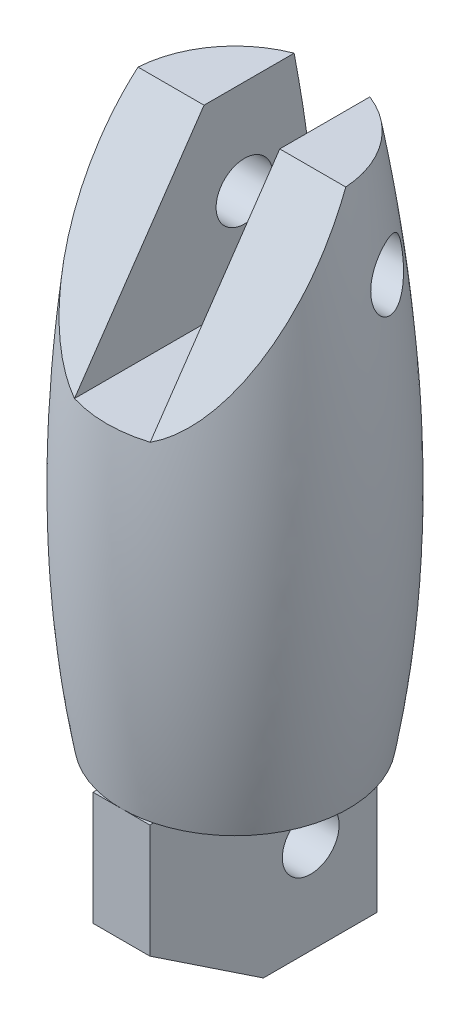
ISO-10303-21;
HEADER;
FILE_DESCRIPTION(('STEP AP214'),'2;1');
FILE_NAME('part.step','',(''),(''),'','','');
FILE_SCHEMA(('AUTOMOTIVE_DESIGN { 1 0 10303 214 1 1 1 1 }'));
ENDSEC;
DATA;
#1=APPLICATION_CONTEXT('core data for automotive mechanical design processes');
#2=APPLICATION_PROTOCOL_DEFINITION('international standard','automotive_design',2000,#1);
#3=PRODUCT_CONTEXT('',#1,'mechanical');
#4=PRODUCT('Part','Part','',(#3));
#5=PRODUCT_RELATED_PRODUCT_CATEGORY('part','',(#4));
#6=PRODUCT_DEFINITION_FORMATION('','',#4);
#7=PRODUCT_DEFINITION_CONTEXT('part definition',#1,'design');
#8=PRODUCT_DEFINITION('design','',#6,#7);
#9=PRODUCT_DEFINITION_SHAPE('','',#8);
#10=(LENGTH_UNIT() NAMED_UNIT(*) SI_UNIT(.MILLI.,.METRE.));
#11=(NAMED_UNIT(*) PLANE_ANGLE_UNIT() SI_UNIT($,.RADIAN.));
#12=(NAMED_UNIT(*) SI_UNIT($,.STERADIAN.) SOLID_ANGLE_UNIT());
#13=UNCERTAINTY_MEASURE_WITH_UNIT(LENGTH_MEASURE(1.E-05),#10,'distance_accuracy_value','');
#14=(GEOMETRIC_REPRESENTATION_CONTEXT(3) GLOBAL_UNCERTAINTY_ASSIGNED_CONTEXT((#13)) GLOBAL_UNIT_ASSIGNED_CONTEXT((#10,
#11,#12)) REPRESENTATION_CONTEXT('',''));
#15=CARTESIAN_POINT('',(0.,0.,0.));
#16=DIRECTION('',(0.,0.,1.));
#17=DIRECTION('',(1.,0.,0.));
#18=AXIS2_PLACEMENT_3D('',#15,#16,#17);
#19=CARTESIAN_POINT('',(0.,0.,0.));
#20=DIRECTION('',(0.,-1.,0.));
#21=DIRECTION('',(0.,0.,-1.));
#22=AXIS2_PLACEMENT_3D('',#19,#20,#21);
#23=PLANE('',#22);
#24=CARTESIAN_POINT('',(0.,0.,0.));
#25=DIRECTION('',(0.,-1.,0.));
#26=DIRECTION('',(0.,0.,-1.));
#27=AXIS2_PLACEMENT_3D('',#24,#25,#26);
#28=CIRCLE('',#27,6.);
#29=CARTESIAN_POINT('',(-1.5,0.,5.80947501931113));
#30=VERTEX_POINT('',#29);
#31=CARTESIAN_POINT('',(-1.5,0.,-5.80947501931113));
#32=VERTEX_POINT('',#31);
#33=EDGE_CURVE('E314',#30,#32,#28,.T.);
#34=ORIENTED_EDGE('',*,*,#33,.T.);
#35=DIRECTION('',(0.,0.,1.));
#36=VECTOR('',#35,1.);
#37=CARTESIAN_POINT('',(-1.5,0.,6.));
#38=LINE('',#37,#36);
#39=EDGE_CURVE('E11',#32,#30,#38,.T.);
#40=ORIENTED_EDGE('',*,*,#39,.T.);
#41=EDGE_LOOP('',(#34,#40));
#42=FACE_BOUND('',#41,.T.);
#43=ADVANCED_FACE('F41',(#42),#23,.T.);
#44=CARTESIAN_POINT('',(0.,28.,0.));
#45=DIRECTION('',(0.,1.,0.));
#46=DIRECTION('',(0.,0.,1.));
#47=AXIS2_PLACEMENT_3D('',#44,#45,#46);
#48=PLANE('',#47);
#49=DIRECTION('',(1.,0.,0.));
#50=VECTOR('',#49,1.);
#51=CARTESIAN_POINT('',(-7.13918542133547,28.,-0.363394388446819));
#52=LINE('',#51,#50);
#53=CARTESIAN_POINT('',(-5.48798182563002,28.,-0.363394388446819));
#54=VERTEX_POINT('',#53);
#55=CARTESIAN_POINT('',(-2.,28.,-0.363394388446819));
#56=VERTEX_POINT('',#55);
#57=EDGE_CURVE('E167',#54,#56,#52,.T.);
#58=ORIENTED_EDGE('',*,*,#57,.T.);
#59=DIRECTION('',(0.,0.,1.));
#60=VECTOR('',#59,1.);
#61=CARTESIAN_POINT('',(-1.99999999999999,28.,0.));
#62=LINE('',#61,#60);
#63=CARTESIAN_POINT('',(-1.99999999999999,28.,-5.1234753829798));
#64=VERTEX_POINT('',#63);
#65=EDGE_CURVE('E320',#64,#56,#62,.T.);
#66=ORIENTED_EDGE('',*,*,#65,.F.);
#67=CARTESIAN_POINT('',(0.,28.,0.));
#68=DIRECTION('',(0.,-1.,0.));
#69=DIRECTION('',(0.,0.,-1.));
#70=AXIS2_PLACEMENT_3D('',#67,#68,#69);
#71=CIRCLE('',#70,5.5);
#72=EDGE_CURVE('E225',#54,#64,#71,.T.);
#73=ORIENTED_EDGE('',*,*,#72,.F.);
#74=EDGE_LOOP('',(#58,#66,#73));
#75=FACE_BOUND('',#74,.T.);
#76=ADVANCED_FACE('F238',(#75),#48,.T.);
#77=DIRECTION('',(0.,0.,1.));
#78=VECTOR('',#77,1.);
#79=CARTESIAN_POINT('',(1.5,0.,6.));
#80=LINE('',#79,#78);
#81=CARTESIAN_POINT('',(1.5,0.,-5.80947501931113));
#82=VERTEX_POINT('',#81);
#83=CARTESIAN_POINT('',(1.5,0.,5.80947501931113));
#84=VERTEX_POINT('',#83);
#85=EDGE_CURVE('E50',#82,#84,#80,.T.);
#86=ORIENTED_EDGE('',*,*,#85,.F.);
#87=EDGE_CURVE('E253',#82,#84,#28,.T.);
#88=ORIENTED_EDGE('',*,*,#87,.T.);
#89=EDGE_LOOP('',(#86,#88));
#90=FACE_BOUND('',#89,.T.);
#91=ADVANCED_FACE('F43',(#90),#23,.T.);
#92=CARTESIAN_POINT('',(0.,0.,-6.));
#93=CARTESIAN_POINT('',(0.,12.2430759518047,-8.27837084267094));
#94=CARTESIAN_POINT('',(0.,28.,-5.5));
#95=B_SPLINE_CURVE_WITH_KNOTS('',2,(#92,#93,#94),.UNSPECIFIED.,.F.,.F.,(3,3),(0.,1.),.UNSPECIFIED.);
#96=CARTESIAN_POINT('',(0.,0.,0.));
#97=DIRECTION('',(0.,-1.,0.));
#98=AXIS1_PLACEMENT('',#96,#97);
#99=SURFACE_OF_REVOLUTION('',#95,#98);
#100=CARTESIAN_POINT('',(-4.82289051304884,23.,-4.));
#101=CARTESIAN_POINT('',(-4.83618173090263,22.9207882573946,-3.99999757371988));
#102=CARTESIAN_POINT('',(-4.85443571640529,22.8424033178471,-3.99368656990657));
#103=CARTESIAN_POINT('',(-4.89905981996882,22.6898096500729,-3.9696182361041));
#104=CARTESIAN_POINT('',(-4.92544303422255,22.6156078908027,-3.9518423853529));
#105=CARTESIAN_POINT('',(-4.98393343120784,22.4735808763478,-3.90655284763595));
#106=CARTESIAN_POINT('',(-5.01598657331945,22.4057039279357,-3.8791288702591));
#107=CARTESIAN_POINT('',(-5.08413151843828,22.2762960524855,-3.81584347605741));
#108=CARTESIAN_POINT('',(-5.12022281647471,22.2147643338226,-3.77998311358422));
#109=CARTESIAN_POINT('',(-5.20146413644888,22.0882448694626,-3.69395554704441));
#110=CARTESIAN_POINT('',(-5.24709692177846,22.0245225731515,-3.64238426961624));
#111=CARTESIAN_POINT('',(-5.33992144775764,21.9067860456513,-3.5302905747743));
#112=CARTESIAN_POINT('',(-5.387114500605,21.8527802453218,-3.46976046611444));
#113=CARTESIAN_POINT('',(-5.48961622640708,21.7466727885073,-3.3295643022627));
#114=CARTESIAN_POINT('',(-5.54491447813438,21.6965218551472,-3.24839977317296));
#115=CARTESIAN_POINT('',(-5.65311083427891,21.611989223929,-3.07669923699058));
#116=CARTESIAN_POINT('',(-5.70600805071554,21.5776133180528,-2.98615980272421));
#117=CARTESIAN_POINT('',(-5.80724680279996,21.5265867197352,-2.79764028336457));
#118=CARTESIAN_POINT('',(-5.85558509518513,21.5099485606784,-2.69965498937426));
#119=CARTESIAN_POINT('',(-5.94549540043634,21.496656173819,-2.49930444471686));
#120=CARTESIAN_POINT('',(-5.98707542337916,21.499978108767,-2.39694456344537));
#121=CARTESIAN_POINT('',(-6.05683638318037,21.5264766014368,-2.20530564791884));
#122=CARTESIAN_POINT('',(-6.08605413233631,21.5470345875387,-2.1160438720968));
#123=CARTESIAN_POINT('',(-6.13715218253985,21.6050230900772,-1.94096907999076));
#124=CARTESIAN_POINT('',(-6.15903940842432,21.6424376040403,-1.855152876667));
#125=CARTESIAN_POINT('',(-6.19294084785359,21.7276964956936,-1.70126036569328));
#126=CARTESIAN_POINT('',(-6.20585359981488,21.7736234801685,-1.6323130737528));
#127=CARTESIAN_POINT('',(-6.2261301192003,21.8767034932493,-1.50246933233631));
#128=CARTESIAN_POINT('',(-6.23349548916772,21.9338532737631,-1.44157056197562));
#129=CARTESIAN_POINT('',(-6.24296641052825,22.054752292602,-1.33260207799689));
#130=CARTESIAN_POINT('',(-6.24530474479897,22.1180602734353,-1.28406106773285));
#131=CARTESIAN_POINT('',(-6.24601816500353,22.2515798773027,-1.1976206914747));
#132=CARTESIAN_POINT('',(-6.24439321436019,22.3217915640454,-1.15972142369687));
#133=CARTESIAN_POINT('',(-6.23776652381487,22.4680398474021,-1.09519335589828));
#134=CARTESIAN_POINT('',(-6.23272564977023,22.544134793841,-1.06870105553852));
#135=CARTESIAN_POINT('',(-6.21980900772834,22.699352546014,-1.02825078854551));
#136=CARTESIAN_POINT('',(-6.21193287022275,22.7784757452062,-1.01429445650301));
#137=CARTESIAN_POINT('',(-6.19353363295528,22.9399393249598,-0.998948930551256));
#138=CARTESIAN_POINT('',(-6.18294135321915,23.0223070453132,-0.997930081044087));
#139=CARTESIAN_POINT('',(-6.15953344795406,23.1857892845728,-1.00929596860461));
#140=CARTESIAN_POINT('',(-6.14671758004228,23.2669036658077,-1.02168216766485));
#141=CARTESIAN_POINT('',(-6.1186359420093,23.4276230244591,-1.05981882115254));
#142=CARTESIAN_POINT('',(-6.10331840495421,23.5071440156679,-1.08588533056251));
#143=CARTESIAN_POINT('',(-6.07040706945675,23.6603686381398,-1.15061793461127));
#144=CARTESIAN_POINT('',(-6.05281311582975,23.734071872251,-1.1892848885028));
#145=CARTESIAN_POINT('',(-6.01481339563449,23.8749730135571,-1.27872441006781));
#146=CARTESIAN_POINT('',(-5.99436095034148,23.9420224196919,-1.32971107046269));
#147=CARTESIAN_POINT('',(-5.95067821874727,24.0661968364386,-1.44159975885199));
#148=CARTESIAN_POINT('',(-5.9274477753216,24.123321285243,-1.50250234776506));
#149=CARTESIAN_POINT('',(-5.87750603031026,24.2273575152491,-1.63354693194513));
#150=CARTESIAN_POINT('',(-5.85073081839019,24.274024286344,-1.70385891582587));
#151=CARTESIAN_POINT('',(-5.79407215906038,24.3545757070358,-1.85029805117541));
#152=CARTESIAN_POINT('',(-5.76418824382436,24.388458429211,-1.92642607743665));
#153=CARTESIAN_POINT('',(-5.70033963820259,24.4439794734639,-2.08498669646966));
#154=CARTESIAN_POINT('',(-5.66626541709301,24.4651226599901,-2.16754813706301));
#155=CARTESIAN_POINT('',(-5.59543069621415,24.4931638967482,-2.33391334766196));
#156=CARTESIAN_POINT('',(-5.55866957528358,24.500058642152,-2.41771740134439));
#157=CARTESIAN_POINT('',(-5.48091328334121,24.4999370710784,-2.58939848042312));
#158=CARTESIAN_POINT('',(-5.43979637134742,24.4920645841814,-2.67721953100372));
#159=CARTESIAN_POINT('',(-5.35646622982175,24.4612992193953,-2.84969816109546));
#160=CARTESIAN_POINT('',(-5.31425227575123,24.4383961593361,-2.93435355497383));
#161=CARTESIAN_POINT('',(-5.22769254305792,24.3763670393064,-3.10349803093446));
#162=CARTESIAN_POINT('',(-5.18337003908947,24.3363536764878,-3.18767514602456));
#163=CARTESIAN_POINT('',(-5.0974027776513,24.2406889489023,-3.34818009283275));
#164=CARTESIAN_POINT('',(-5.05575666212777,24.1850455933391,-3.42451191738476));
#165=CARTESIAN_POINT('',(-4.98593030079189,24.071358886236,-3.55260763359261));
#166=CARTESIAN_POINT('',(-4.95672449305451,24.0160348379426,-3.60622853720659));
#167=CARTESIAN_POINT('',(-4.90390317376167,23.8962015098565,-3.70534067046411));
#168=CARTESIAN_POINT('',(-4.88027981638235,23.831705327814,-3.75084328758952));
#169=CARTESIAN_POINT('',(-4.84394926208104,23.7053861950175,-3.82549272593903));
#170=CARTESIAN_POINT('',(-4.83010739800128,23.6447491486821,-3.8560876332075));
#171=CARTESIAN_POINT('',(-4.80924938099039,23.5188801274321,-3.90904652764358));
#172=CARTESIAN_POINT('',(-4.80222720211922,23.4536522637748,-3.93141777043619));
#173=CARTESIAN_POINT('',(-4.79605401559558,23.3238208151284,-3.96608948787934));
#174=CARTESIAN_POINT('',(-4.79651502437905,23.2593591421545,-3.97885062289989));
#175=CARTESIAN_POINT('',(-4.80451248176753,23.1297484889766,-3.99580822381109));
#176=CARTESIAN_POINT('',(-4.81205116888537,23.0645992977719,-4.00000197869642));
#177=CARTESIAN_POINT('',(-4.82289051304884,23.,-4.));
#178=B_SPLINE_CURVE_WITH_KNOTS('',3,(#100,#101,#102,#103,#104,#105,#106,#107,#108,#109,#110,
#111,#112,#113,#114,#115,#116,#117,#118,#119,#120,#121,#122,#123,#124,#125,#126,#127,#128,#129,
#130,#131,#132,#133,#134,#135,#136,#137,#138,#139,#140,#141,#142,#143,#144,#145,#146,#147,#148,
#149,#150,#151,#152,#153,#154,#155,#156,#157,#158,#159,#160,#161,#162,#163,#164,#165,#166,#167,
#168,#169,#170,#171,#172,#173,#174,#175,#176,#177),.UNSPECIFIED.,.T.,.F.,(4,2,2,2,2,2,2,2,2,2,2,
2,2,2,2,2,2,2,2,2,2,2,2,2,2,2,2,2,2,2,2,2,2,2,2,2,2,2,4),(0.,0.240649621626491,
0.481688975087069,0.720543896539636,0.959368982532695,1.2398009831928,1.52047514922411,
1.84977360586117,2.17919287165075,2.50884474914026,2.83810301971859,3.12485446467628,
3.4113342585066,3.66158445213614,3.911762325029,4.15008090591224,4.38840168624735,
4.62949998075772,4.87062970800995,5.11864687837231,5.36669110091579,5.62073593108188,
5.87479808876475,6.13364075664209,6.39249807167551,6.65690103321698,6.92134384226982,
7.19549403183061,7.46970780151181,7.76031272572522,8.05111471809741,8.35928660865184,
8.66730087131147,8.91354298000469,9.1594369229655,9.36650473505518,9.57338941309282,
9.7695835525304,9.96583976473856),.UNSPECIFIED.);
#179=CARTESIAN_POINT('',(-4.82289051304884,23.,-4.));
#180=VERTEX_POINT('',#179);
#181=EDGE_CURVE('E268',#180,#180,#178,.T.);
#182=ORIENTED_EDGE('',*,*,#181,.F.);
#183=EDGE_LOOP('',(#182));
#184=FACE_BOUND('',#183,.T.);
#185=CARTESIAN_POINT('',(4.82289051304884,23.,-4.));
#186=CARTESIAN_POINT('',(4.81168817468081,23.0668052948499,-3.99999559906185));
#187=CARTESIAN_POINT('',(4.8039980798832,23.1342610697738,-3.99550953823272));
#188=CARTESIAN_POINT('',(4.79622165890971,23.2683411765881,-3.97735295940693));
#189=CARTESIAN_POINT('',(4.79613333458801,23.3349657223657,-3.9636848558869));
#190=CARTESIAN_POINT('',(4.80332996667337,23.4652557422875,-3.92762031930057));
#191=CARTESIAN_POINT('',(4.81060284357937,23.528925885491,-3.90523822265195));
#192=CARTESIAN_POINT('',(4.8316331604439,23.6517911211947,-3.85264273163989));
#193=CARTESIAN_POINT('',(4.84539413325442,23.7109837552314,-3.82242507475182));
#194=CARTESIAN_POINT('',(4.87865929365541,23.8254341371371,-3.75428288314656));
#195=CARTESIAN_POINT('',(4.89831956088015,23.8805263503003,-3.71615893895478));
#196=CARTESIAN_POINT('',(4.94184445784589,23.9841635200453,-3.63393290844881));
#197=CARTESIAN_POINT('',(4.96571054739854,24.0327061929645,-3.58982874767262));
#198=CARTESIAN_POINT('',(5.02115983965327,24.1313595122717,-3.48790223433885));
#199=CARTESIAN_POINT('',(5.05335185126129,24.1800697662931,-3.42905620986574));
#200=CARTESIAN_POINT('',(5.12023469155587,24.2675352366083,-3.30565695387869));
#201=CARTESIAN_POINT('',(5.15492736638118,24.3062829995954,-3.24109949768243));
#202=CARTESIAN_POINT('',(5.23163474997289,24.3794356586891,-3.09571952138001));
#203=CARTESIAN_POINT('',(5.27386870174313,24.4118952042003,-3.01402722737081));
#204=CARTESIAN_POINT('',(5.35818419466923,24.4621432033285,-2.84614905391292));
#205=CARTESIAN_POINT('',(5.40026566160172,24.4799252740838,-2.75996123677892));
#206=CARTESIAN_POINT('',(5.48558796356965,24.5008224606803,-2.57941195148664));
#207=CARTESIAN_POINT('',(5.52872879713877,24.5029187277832,-2.48488164682918));
#208=CARTESIAN_POINT('',(5.61202866334405,24.4890549165726,-2.29581555978803));
#209=CARTESIAN_POINT('',(5.65218841760265,24.4730992233406,-2.20127978431027));
#210=CARTESIAN_POINT('',(5.72711095388587,24.423904409263,-2.01937070624732));
#211=CARTESIAN_POINT('',(5.76202756702018,24.3914012945639,-1.93186267488351));
#212=CARTESIAN_POINT('',(5.82795574115446,24.3099485878636,-1.76325847209024));
#213=CARTESIAN_POINT('',(5.85896887817113,24.2610056628574,-1.68215971788752));
#214=CARTESIAN_POINT('',(5.91513366252596,24.1516575163332,-1.53483848401427));
#215=CARTESIAN_POINT('',(5.94053786427728,24.0922300780497,-1.46798557550526));
#216=CARTESIAN_POINT('',(5.98811876820248,23.9617353086639,-1.34541290773155));
#217=CARTESIAN_POINT('',(6.01029624097665,23.8906707653545,-1.28969048911858));
#218=CARTESIAN_POINT('',(6.0508097376014,23.7423687712218,-1.1937251961819));
#219=CARTESIAN_POINT('',(6.06927017681883,23.6655296762919,-1.15291840941564));
#220=CARTESIAN_POINT('',(6.10370393053132,23.5054783332624,-1.08506416806785));
#221=CARTESIAN_POINT('',(6.11967755166833,23.4222668728104,-1.05801501614036));
#222=CARTESIAN_POINT('',(6.14885706765612,23.2539989904538,-1.01920060342744));
#223=CARTESIAN_POINT('',(6.16211897939271,23.1690312999562,-1.00709252029098));
#224=CARTESIAN_POINT('',(6.18619523081419,22.997926444714,-0.99755689725292));
#225=CARTESIAN_POINT('',(6.19700976123689,22.9117893716608,-1.00012821289559));
#226=CARTESIAN_POINT('',(6.21564072486032,22.7425687397255,-1.01984924128362));
#227=CARTESIAN_POINT('',(6.22351087499139,22.6594583209878,-1.03671730441085));
#228=CARTESIAN_POINT('',(6.23598699899696,22.4970397433252,-1.08430640437086));
#229=CARTESIAN_POINT('',(6.24059342625836,22.4177310577023,-1.11502551608563));
#230=CARTESIAN_POINT('',(6.24577097020691,22.2672231319434,-1.18855854738604));
#231=CARTESIAN_POINT('',(6.24643932613422,22.1958715592207,-1.23105363414895));
#232=CARTESIAN_POINT('',(6.24329198335125,22.0612202377525,-1.32717016850882));
#233=CARTESIAN_POINT('',(6.2394773852951,21.9979185168367,-1.38078888237354));
#234=CARTESIAN_POINT('',(6.22691679899199,21.8829433342529,-1.4957094957082));
#235=CARTESIAN_POINT('',(6.21831698358884,21.8309859601563,-1.55674358486311));
#236=CARTESIAN_POINT('',(6.19590093177886,21.7378002475836,-1.68564454197517));
#237=CARTESIAN_POINT('',(6.18208540669978,21.6965704473566,-1.75351047726786));
#238=CARTESIAN_POINT('',(6.14928066550057,21.6260236334627,-1.89316101760218));
#239=CARTESIAN_POINT('',(6.13034110471681,21.5965986888321,-1.96490297983149));
#240=CARTESIAN_POINT('',(6.08742847196607,21.5493853557694,-2.11065506557533));
#241=CARTESIAN_POINT('',(6.06345466586202,21.5315986660868,-2.18466551855491));
#242=CARTESIAN_POINT('',(6.0097814293241,21.5069151578154,-2.33615747874194));
#243=CARTESIAN_POINT('',(5.97987684830269,21.5005306771956,-2.41364873301772));
#244=CARTESIAN_POINT('',(5.91583020914774,21.4995322581337,-2.56691897798409));
#245=CARTESIAN_POINT('',(5.88168643959779,21.5049230882089,-2.64269726243706));
#246=CARTESIAN_POINT('',(5.80622134281989,21.5277450549008,-2.79889641833629));
#247=CARTESIAN_POINT('',(5.76452284705107,21.546394017488,-2.87895572890007));
#248=CARTESIAN_POINT('',(5.67825284586149,21.5957654177938,-3.0335941678163));
#249=CARTESIAN_POINT('',(5.63368009372682,21.6264931245396,-3.1081708876607));
#250=CARTESIAN_POINT('',(5.53682700127012,21.7038026881663,-3.26033024434488));
#251=CARTESIAN_POINT('',(5.48431642514491,21.7519612380462,-3.336967657048));
#252=CARTESIAN_POINT('',(5.37917223356617,21.8612096230055,-3.4804609352256));
#253=CARTESIAN_POINT('',(5.32653854623996,21.9223153361979,-3.54730461805244));
#254=CARTESIAN_POINT('',(5.21942785418122,22.0618285649494,-3.67449078157484));
#255=CARTESIAN_POINT('',(5.1651270258134,22.1412135264308,-3.73392020479068));
#256=CARTESIAN_POINT('',(5.06270359064151,22.3130830717129,-3.83722759897444));
#257=CARTESIAN_POINT('',(5.01457332250493,22.4055511054445,-3.88112497605093));
#258=CARTESIAN_POINT('',(4.93850587378212,22.5808428304061,-3.94254709171123));
#259=CARTESIAN_POINT('',(4.90845269596701,22.6614283642748,-3.96372198791322));
#260=CARTESIAN_POINT('',(4.87054247964568,22.7861058208345,-3.98527073059469));
#261=CARTESIAN_POINT('',(4.85910620880893,22.8282671039077,-3.9907511043751));
#262=CARTESIAN_POINT('',(4.83891720668913,22.9135277312031,-3.99811658971576));
#263=CARTESIAN_POINT('',(4.83016361329694,22.9566267692882,-4.00000285730205));
#264=CARTESIAN_POINT('',(4.82289051304884,23.,-4.));
#265=B_SPLINE_CURVE_WITH_KNOTS('',3,(#185,#186,#187,#188,#189,#190,#191,#192,#193,#194,#195,
#196,#197,#198,#199,#200,#201,#202,#203,#204,#205,#206,#207,#208,#209,#210,#211,#212,#213,#214,
#215,#216,#217,#218,#219,#220,#221,#222,#223,#224,#225,#226,#227,#228,#229,#230,#231,#232,#233,
#234,#235,#236,#237,#238,#239,#240,#241,#242,#243,#244,#245,#246,#247,#248,#249,#250,#251,#252,
#253,#254,#255,#256,#257,#258,#259,#260,#261,#262,#263,#264),.UNSPECIFIED.,.T.,.F.,(4,2,2,2,2,2,
2,2,2,2,2,2,2,2,2,2,2,2,2,2,2,2,2,2,2,2,2,2,2,2,2,2,2,2,2,2,2,2,2,4),(0.,0.20304879810575,
0.406044224125353,0.608707080197285,0.811480416481162,1.0201792877618,1.22895074015602,
1.47671351809881,1.72466112066437,2.0159815293908,2.30742855933129,2.61765419954207,
2.92780449764705,3.22522922349961,3.52253347716537,3.80008184448636,4.07756381913559,
4.34307970251556,4.60856281996552,4.8678338155677,5.12708459779933,5.38134369603328,
5.63556746640294,5.88348670931712,6.13134509585321,6.37201778023209,6.61265765309362,
6.85104428554326,7.08946570575911,7.33835371031742,7.58734252298096,7.86277270365699,
8.13832316690732,8.45094176610778,8.76394599613961,9.10135136627801,9.43833367299255,
9.70244838053195,9.83431991055153,9.9661490175972),.UNSPECIFIED.);
#266=CARTESIAN_POINT('',(4.82289051304884,23.,-4.));
#267=VERTEX_POINT('',#266);
#268=EDGE_CURVE('E337',#267,#267,#265,.T.);
#269=ORIENTED_EDGE('',*,*,#268,.F.);
#270=EDGE_LOOP('',(#269));
#271=FACE_BOUND('',#270,.T.);
#272=CARTESIAN_POINT('',(-5.48798182563002,28.,-0.363394388446818));
#273=CARTESIAN_POINT('',(-5.51583583416864,27.8745326938426,-0.277530374538856));
#274=CARTESIAN_POINT('',(-5.54146456050901,27.7487380113903,-0.191442319455523));
#275=CARTESIAN_POINT('',(-5.58834023093832,27.496597464893,-0.0188890061322377));
#276=CARTESIAN_POINT('',(-5.60958730933731,27.3702516178641,0.0675762404627272));
#277=CARTESIAN_POINT('',(-5.66688676384528,26.9903642263625,0.327553578514721));
#278=CARTESIAN_POINT('',(-5.69646081686844,26.7361385071572,0.501533887474385));
#279=CARTESIAN_POINT('',(-5.73863282642592,26.2266478537714,0.850205695996515));
#280=CARTESIAN_POINT('',(-5.7512240328102,25.9713825467963,1.0248974506823));
#281=CARTESIAN_POINT('',(-5.75948403420388,25.4583714882805,1.37597846144439));
#282=CARTESIAN_POINT('',(-5.75500024549273,25.2006239987255,1.55236890693731));
#283=CARTESIAN_POINT('',(-5.72855670224102,24.6858072520209,1.90468564707389));
#284=CARTESIAN_POINT('',(-5.70660154071522,24.4287378344324,2.08061205151465));
#285=CARTESIAN_POINT('',(-5.64475703102864,23.9161444621675,2.4314072171498));
#286=CARTESIAN_POINT('',(-5.60487441114261,23.660619964103,2.60627635021391));
#287=CARTESIAN_POINT('',(-5.52267012840466,23.2359649181911,2.89689059774171));
#288=CARTESIAN_POINT('',(-5.48549516818722,23.0661469845212,3.01310612722923));
#289=CARTESIAN_POINT('',(-5.40245072170583,22.7279762287633,3.2445345316873));
#290=CARTESIAN_POINT('',(-5.35658227066483,22.5596232347241,3.35974752433337));
#291=CARTESIAN_POINT('',(-5.25576771903438,22.2247427429916,3.58892422446551));
#292=CARTESIAN_POINT('',(-5.20082007124987,22.0582155616036,3.70288771548696));
#293=CARTESIAN_POINT('',(-5.08149253540119,21.7277489716478,3.92904374565225));
#294=CARTESIAN_POINT('',(-5.01712731741632,21.5638059697957,4.04123874387339));
#295=CARTESIAN_POINT('',(-4.87837487068567,21.2388432704809,4.26362816617063));
#296=CARTESIAN_POINT('',(-4.80398875873699,21.0778232495271,4.37382281162906));
#297=CARTESIAN_POINT('',(-4.64459057306335,20.759462090035,4.59169444579082));
#298=CARTESIAN_POINT('',(-4.55958271811091,20.6021195201668,4.69937241403006));
#299=CARTESIAN_POINT('',(-4.38416429021257,20.302162473815,4.90464912545821));
#300=CARTESIAN_POINT('',(-4.29447815487331,20.1592604448727,5.0024446562333));
#301=CARTESIAN_POINT('',(-4.10452077007486,19.8783389276929,5.19469433303685));
#302=CARTESIAN_POINT('',(-4.00425125603066,19.740318643909,5.2891490235005));
#303=CARTESIAN_POINT('',(-3.79284307980147,19.4709040972955,5.47352386253948));
#304=CARTESIAN_POINT('',(-3.6817554135248,19.3394827874591,5.5634625208338));
#305=CARTESIAN_POINT('',(-3.44764135976947,19.0841418621281,5.73820602522039));
#306=CARTESIAN_POINT('',(-3.32461764747403,18.9602205757441,5.82301201479212));
#307=CARTESIAN_POINT('',(-3.02072235906035,18.6801150524905,6.0147032631415));
#308=CARTESIAN_POINT('',(-2.83460886859778,18.5276921531147,6.11901443672704));
#309=CARTESIAN_POINT('',(-2.53659394468758,18.3159033078494,6.26395291442572));
#310=CARTESIAN_POINT('',(-2.43365877646053,18.2478735552034,6.31050932665974));
#311=CARTESIAN_POINT('',(-2.22151412268894,18.118582600847,6.39899006832089));
#312=CARTESIAN_POINT('',(-2.1122959361106,18.0573311465621,6.44090772706141));
#313=CARTESIAN_POINT('',(-1.9999999999992,17.9999999999996,6.48014250874732));
#314=B_SPLINE_CURVE_WITH_KNOTS('',3,(#272,#273,#274,#275,#276,#277,#278,#279,#280,#281,#282,
#283,#284,#285,#286,#287,#288,#289,#290,#291,#292,#293,#294,#295,#296,#297,#298,#299,#300,#301,
#302,#303,#304,#305,#306,#307,#308,#309,#310,#311,#312,#313),.UNSPECIFIED.,.F.,.F.,(4,2,2,2,2,2,
2,2,2,2,2,2,2,2,2,2,2,2,2,2,4),(0.,0.463660092535614,0.927305970450226,1.85520900492226,
2.78348074323296,3.72006698532779,4.65640709141771,5.59239607688893,6.21955422305176,
6.84663773394281,7.47382821718603,8.10005190504028,8.72620585988219,9.35211190307377,
9.93679993471331,10.5213922403397,11.1033511848779,11.685179997031,12.4692854904889,
12.8645559936087,13.2603877188415),.UNSPECIFIED.);
#315=CARTESIAN_POINT('',(-2.,18.,6.48014250874703));
#316=VERTEX_POINT('',#315);
#317=EDGE_CURVE('E200',#54,#316,#314,.T.);
#318=ORIENTED_EDGE('',*,*,#317,.F.);
#319=ORIENTED_EDGE('',*,*,#72,.T.);
#320=CARTESIAN_POINT('',(-2.,18.,-6.48014250874704));
#321=CARTESIAN_POINT('',(-2.,18.3357224569417,-6.45336632086844));
#322=CARTESIAN_POINT('',(-2.,18.6712852552264,-6.42460265699132));
#323=CARTESIAN_POINT('',(-2.,19.3418943094421,-6.3632074985828));
#324=CARTESIAN_POINT('',(-2.,19.6769407361565,-6.33057787038373));
#325=CARTESIAN_POINT('',(-2.,20.3465265098374,-6.26154395975844));
#326=CARTESIAN_POINT('',(-2.,20.6810659924375,-6.22514099133867));
#327=CARTESIAN_POINT('',(-2.,21.3496471991345,-6.14864415482859));
#328=CARTESIAN_POINT('',(-2.,21.6836890172624,-6.10855110808437));
#329=CARTESIAN_POINT('',(-2.,22.3512831658406,-6.02475022695138));
#330=CARTESIAN_POINT('',(-2.,22.6848355438358,-5.981042771104));
#331=CARTESIAN_POINT('',(-2.,23.3514455278758,-5.8900823983582));
#332=CARTESIAN_POINT('',(-2.,23.6845031492692,-5.84282959389186));
#333=CARTESIAN_POINT('',(-2.,24.3501468931948,-5.74483521041734));
#334=CARTESIAN_POINT('',(-2.,24.6827329519062,-5.694093198061));
#335=CARTESIAN_POINT('',(-2.,25.3474415060888,-5.58916859635635));
#336=CARTESIAN_POINT('',(-2.,25.6795638748977,-5.53498520481672));
#337=CARTESIAN_POINT('',(-2.,26.3433513446841,-5.42321608856476));
#338=CARTESIAN_POINT('',(-2.,26.6750162523122,-5.36562921586079));
#339=CARTESIAN_POINT('',(-1.99999999999999,27.3378926132433,-5.24707523756492));
#340=CARTESIAN_POINT('',(-1.99999999999999,27.6691038015448,-5.1861066501443));
#341=CARTESIAN_POINT('',(-1.99999999999999,28.,-5.1234753829798));
#342=B_SPLINE_CURVE_WITH_KNOTS('',3,(#320,#321,#322,#323,#324,#325,#326,#327,#328,#329,#330,
#331,#332,#333,#334,#335,#336,#337,#338,#339,#340,#341),.UNSPECIFIED.,.F.,.F.,(4,2,2,2,2,2,2,2,
2,2,4),(0.,1.01035809617504,2.02023040437202,3.02975221440261,4.03904986367627,5.04824194154631,
6.05740202887004,7.06668767772937,8.07620946243151,9.08607372323407,10.0963840456335),.UNSPECIFIED.);
#343=CARTESIAN_POINT('',(-2.,18.,-6.48014250874703));
#344=VERTEX_POINT('',#343);
#345=EDGE_CURVE('E218',#344,#64,#342,.T.);
#346=ORIENTED_EDGE('',*,*,#345,.F.);
#347=CARTESIAN_POINT('',(0.,18.,0.));
#348=DIRECTION('',(0.,-1.,0.));
#349=DIRECTION('',(0.,0.,-1.));
#350=AXIS2_PLACEMENT_3D('',#347,#348,#349);
#351=CIRCLE('',#350,6.78175839540678);
#352=CARTESIAN_POINT('',(2.,18.,-6.48014250874704));
#353=VERTEX_POINT('',#352);
#354=EDGE_CURVE('E323',#353,#344,#351,.F.);
#355=ORIENTED_EDGE('',*,*,#354,.F.);
#356=CARTESIAN_POINT('',(1.99999999999999,28.,-5.1234753829798));
#357=CARTESIAN_POINT('',(1.99999999999999,27.6691038015448,-5.18610665014429));
#358=CARTESIAN_POINT('',(1.99999999999999,27.3378926132433,-5.24707523756492));
#359=CARTESIAN_POINT('',(1.99999999999999,26.6750162523122,-5.36562921586079));
#360=CARTESIAN_POINT('',(1.99999999999999,26.3433513446841,-5.42321608856476));
#361=CARTESIAN_POINT('',(1.99999999999999,25.6795638748977,-5.53498520481672));
#362=CARTESIAN_POINT('',(1.99999999999999,25.3474415060888,-5.58916859635635));
#363=CARTESIAN_POINT('',(1.99999999999999,24.6827329519062,-5.694093198061));
#364=CARTESIAN_POINT('',(2.,24.3501468931948,-5.74483521041734));
#365=CARTESIAN_POINT('',(2.,23.6845031492692,-5.84282959389186));
#366=CARTESIAN_POINT('',(2.,23.3514455278758,-5.8900823983582));
#367=CARTESIAN_POINT('',(2.,22.6848355438358,-5.981042771104));
#368=CARTESIAN_POINT('',(2.,22.3512831658406,-6.02475022695138));
#369=CARTESIAN_POINT('',(2.,21.6836890172624,-6.10855110808438));
#370=CARTESIAN_POINT('',(2.,21.3496471991345,-6.14864415482859));
#371=CARTESIAN_POINT('',(2.,20.6810659924375,-6.22514099133867));
#372=CARTESIAN_POINT('',(2.,20.3465265098374,-6.26154395975844));
#373=CARTESIAN_POINT('',(2.,19.6769407361565,-6.33057787038373));
#374=CARTESIAN_POINT('',(2.,19.3418943094421,-6.36320749858281));
#375=CARTESIAN_POINT('',(2.,18.6712852552264,-6.42460265699132));
#376=CARTESIAN_POINT('',(2.,18.3357224569417,-6.45336632086844));
#377=CARTESIAN_POINT('',(2.,18.,-6.48014250874704));
#378=B_SPLINE_CURVE_WITH_KNOTS('',3,(#356,#357,#358,#359,#360,#361,#362,#363,#364,#365,#366,
#367,#368,#369,#370,#371,#372,#373,#374,#375,#376,#377),.UNSPECIFIED.,.F.,.F.,(4,2,2,2,2,2,2,2,
2,2,4),(0.,1.01031032239941,2.02017458320198,3.02969636790411,4.03898201676345,5.04814210408718,
6.05733418195721,7.06663183123087,8.07615364126147,9.08602594945845,10.0963840456335),.UNSPECIFIED.);
#379=CARTESIAN_POINT('',(1.99999999999999,28.,-5.1234753829798));
#380=VERTEX_POINT('',#379);
#381=EDGE_CURVE('E210',#380,#353,#378,.T.);
#382=ORIENTED_EDGE('',*,*,#381,.F.);
#383=CARTESIAN_POINT('',(5.48798182563001,28.,-0.363394388446819));
#384=VERTEX_POINT('',#383);
#385=EDGE_CURVE('E315',#380,#384,#71,.T.);
#386=ORIENTED_EDGE('',*,*,#385,.T.);
#387=CARTESIAN_POINT('',(2.,18.,6.48014250874704));
#388=CARTESIAN_POINT('',(2.10438923968535,18.0532907311834,6.44367280023383));
#389=CARTESIAN_POINT('',(2.20614793347452,18.109991130664,6.40486967264073));
#390=CARTESIAN_POINT('',(2.40403165712455,18.2292032426213,6.32328642396352));
#391=CARTESIAN_POINT('',(2.50017427401886,18.2916950304559,6.28051993838172));
#392=CARTESIAN_POINT('',(2.68706448397627,18.4217891108597,6.19148957444672));
#393=CARTESIAN_POINT('',(2.77781677186586,18.4893868361521,6.14522882172627));
#394=CARTESIAN_POINT('',(2.9528729177248,18.6280812722604,6.05031277263201));
#395=CARTESIAN_POINT('',(3.0372490187594,18.6991160888825,6.00169983377808));
#396=CARTESIAN_POINT('',(3.20112181575814,18.8450184868929,5.90185098936082));
#397=CARTESIAN_POINT('',(3.28061451050939,18.9198891214232,5.85061299436835));
#398=CARTESIAN_POINT('',(3.43483083966079,19.0729370768796,5.74587406134778));
#399=CARTESIAN_POINT('',(3.50955255720402,19.1511157061587,5.69237222794341));
#400=CARTESIAN_POINT('',(3.73602694109611,19.4000800412431,5.52199256661982));
#401=CARTESIAN_POINT('',(3.87967714927444,19.5759277225706,5.40165055707477));
#402=CARTESIAN_POINT('',(4.14779159037819,19.9372094436556,5.15440607822208));
#403=CARTESIAN_POINT('',(4.27225241841679,20.1226451769019,5.02750244996916));
#404=CARTESIAN_POINT('',(4.50453981301935,20.5022852004295,4.76769439910291));
#405=CARTESIAN_POINT('',(4.61222733030293,20.6965471487686,4.63475051798499));
#406=CARTESIAN_POINT('',(4.81117901635036,21.0906666614232,4.36503337530937));
#407=CARTESIAN_POINT('',(4.90244265480234,21.2905244061812,4.22825999026524));
#408=CARTESIAN_POINT('',(5.11731764943667,21.8093402412952,3.8732064592201));
#409=CARTESIAN_POINT('',(5.22984268795945,22.1314442359085,3.65277340203318));
#410=CARTESIAN_POINT('',(5.42102948508704,22.7824727641363,3.2072396266279));
#411=CARTESIAN_POINT('',(5.49967209708066,23.1114010443407,2.98213634441696));
#412=CARTESIAN_POINT('',(5.62533760807049,23.7727424746998,2.52954489638644));
#413=CARTESIAN_POINT('',(5.67241289982719,24.1051489159473,2.30206132183218));
#414=CARTESIAN_POINT('',(5.73666430354556,24.7718017242515,1.84583501270744));
#415=CARTESIAN_POINT('',(5.75385075870314,25.1060474146419,1.61709274121597));
#416=CARTESIAN_POINT('',(5.75815898628551,25.6551081112255,1.24134102762905));
#417=CARTESIAN_POINT('',(5.75383166714604,25.8699054664373,1.09434366504791));
#418=CARTESIAN_POINT('',(5.73318512879316,26.2990797765582,0.80063664238391));
#419=CARTESIAN_POINT('',(5.71686801459775,26.5134567986406,0.653926936330776));
#420=CARTESIAN_POINT('',(5.67224496110043,26.9406658050339,0.361564876524158));
#421=CARTESIAN_POINT('',(5.64397779025525,27.1535005415552,0.215910639285338));
#422=CARTESIAN_POINT('',(5.57521386881142,27.5778657046521,-0.0745052258683749));
#423=CARTESIAN_POINT('',(5.53471443656679,27.7893958348356,-0.219266650946291));
#424=CARTESIAN_POINT('',(5.48798182563002,28.,-0.363394388446818));
#425=B_SPLINE_CURVE_WITH_KNOTS('',3,(#387,#388,#389,#390,#391,#392,#393,#394,#395,#396,#397,
#398,#399,#400,#401,#402,#403,#404,#405,#406,#407,#408,#409,#410,#411,#412,#413,#414,#415,#416,
#417,#418,#419,#420,#421,#422,#423,#424),.UNSPECIFIED.,.F.,.F.,(4,2,2,2,2,2,2,2,2,2,2,2,2,2,2,2,
2,2,4),(0.,0.368054046241748,0.734885789721836,1.10139320081886,1.46279268987152,
1.82448444675466,2.18632061942919,2.95598621042845,3.72578821103277,4.50166630905557,
5.27756945497209,6.49435938178455,7.71183600510099,8.92728692935648,10.1423171563914,
10.9230205033378,11.7035868169108,12.481640013044,13.2598639036588),.UNSPECIFIED.);
#426=CARTESIAN_POINT('',(2.,18.,6.48014250874704));
#427=VERTEX_POINT('',#426);
#428=EDGE_CURVE('E175',#427,#384,#425,.T.);
#429=ORIENTED_EDGE('',*,*,#428,.F.);
#430=EDGE_CURVE('E254',#316,#427,#351,.F.);
#431=ORIENTED_EDGE('',*,*,#430,.F.);
#432=EDGE_LOOP('',(#318,#319,#346,#355,#382,#386,#429,#431));
#433=FACE_BOUND('',#432,.T.);
#434=CARTESIAN_POINT('',(0.,0.,-6.));
#435=VERTEX_POINT('',#434);
#436=EDGE_CURVE('E256',#435,#82,#28,.T.);
#437=ORIENTED_EDGE('',*,*,#436,.F.);
#438=EDGE_CURVE('E60',#32,#435,#28,.T.);
#439=ORIENTED_EDGE('',*,*,#438,.F.);
#440=ORIENTED_EDGE('',*,*,#33,.F.);
#441=CARTESIAN_POINT('',(0.,0.,6.));
#442=VERTEX_POINT('',#441);
#443=EDGE_CURVE('E316',#442,#30,#28,.T.);
#444=ORIENTED_EDGE('',*,*,#443,.F.);
#445=EDGE_CURVE('E161',#84,#442,#28,.T.);
#446=ORIENTED_EDGE('',*,*,#445,.F.);
#447=ORIENTED_EDGE('',*,*,#87,.F.);
#448=EDGE_LOOP('',(#437,#439,#440,#444,#446,#447));
#449=FACE_BOUND('',#448,.T.);
#450=ADVANCED_FACE('F184',(#184,#271,#433,#449),#99,.F.);
#451=CARTESIAN_POINT('',(1.99999999999999,28.,-0.363394388446819));
#452=VERTEX_POINT('',#451);
#453=EDGE_CURVE('E163',#452,#384,#52,.T.);
#454=ORIENTED_EDGE('',*,*,#453,.T.);
#455=ORIENTED_EDGE('',*,*,#385,.F.);
#456=DIRECTION('',(0.,0.,-1.));
#457=VECTOR('',#456,1.);
#458=CARTESIAN_POINT('',(1.99999999999999,28.,0.));
#459=LINE('',#458,#457);
#460=EDGE_CURVE('E264',#452,#380,#459,.T.);
#461=ORIENTED_EDGE('',*,*,#460,.F.);
#462=EDGE_LOOP('',(#454,#455,#461));
#463=FACE_BOUND('',#462,.T.);
#464=ADVANCED_FACE('F233',(#463),#48,.T.);
#465=CARTESIAN_POINT('',(-1.99999999999999,28.,-11.5));
#466=DIRECTION('',(-1.,0.,0.));
#467=DIRECTION('',(0.,-1.,0.));
#468=AXIS2_PLACEMENT_3D('',#465,#466,#467);
#469=PLANE('',#468);
#470=CARTESIAN_POINT('',(-2.,23.,-2.5));
#471=DIRECTION('',(-1.,0.,0.));
#472=DIRECTION('',(0.,-1.,0.));
#473=AXIS2_PLACEMENT_3D('',#470,#471,#472);
#474=CIRCLE('',#473,1.5);
#475=CARTESIAN_POINT('',(-2.,21.5,-2.5));
#476=VERTEX_POINT('',#475);
#477=EDGE_CURVE('E334',#476,#476,#474,.T.);
#478=ORIENTED_EDGE('',*,*,#477,.T.);
#479=EDGE_LOOP('',(#478));
#480=FACE_BOUND('',#479,.T.);
#481=ORIENTED_EDGE('',*,*,#65,.T.);
#482=DIRECTION('',(0.,-0.825252196872558,0.564764385878764));
#483=VECTOR('',#482,1.);
#484=CARTESIAN_POINT('',(-1.99999999999999,33.1904717458259,-3.91551287908703));
#485=LINE('',#484,#483);
#486=EDGE_CURVE('E182',#56,#316,#485,.T.);
#487=ORIENTED_EDGE('',*,*,#486,.T.);
#488=DIRECTION('',(0.,0.,1.));
#489=VECTOR('',#488,1.);
#490=CARTESIAN_POINT('',(-2.,18.,-11.5));
#491=LINE('',#490,#489);
#492=EDGE_CURVE('E206',#344,#316,#491,.T.);
#493=ORIENTED_EDGE('',*,*,#492,.F.);
#494=ORIENTED_EDGE('',*,*,#345,.T.);
#495=EDGE_LOOP('',(#481,#487,#493,#494));
#496=FACE_BOUND('',#495,.T.);
#497=ADVANCED_FACE('F230',(#480,#496),#469,.F.);
#498=CARTESIAN_POINT('',(1.99999999999999,28.,-11.5));
#499=DIRECTION('',(1.,0.,0.));
#500=DIRECTION('',(0.,1.,0.));
#501=AXIS2_PLACEMENT_3D('',#498,#499,#500);
#502=PLANE('',#501);
#503=CARTESIAN_POINT('',(2.,23.,-2.5));
#504=DIRECTION('',(1.,0.,0.));
#505=DIRECTION('',(0.,1.,0.));
#506=AXIS2_PLACEMENT_3D('',#503,#504,#505);
#507=CIRCLE('',#506,1.5);
#508=CARTESIAN_POINT('',(2.,24.5,-2.5));
#509=VERTEX_POINT('',#508);
#510=EDGE_CURVE('E45',#509,#509,#507,.T.);
#511=ORIENTED_EDGE('',*,*,#510,.T.);
#512=EDGE_LOOP('',(#511));
#513=FACE_BOUND('',#512,.T.);
#514=DIRECTION('',(0.,0.,1.));
#515=VECTOR('',#514,1.);
#516=CARTESIAN_POINT('',(2.,18.,-11.5));
#517=LINE('',#516,#515);
#518=EDGE_CURVE('E207',#353,#427,#517,.T.);
#519=ORIENTED_EDGE('',*,*,#518,.T.);
#520=DIRECTION('',(0.,0.825252196872558,-0.564764385878764));
#521=VECTOR('',#520,1.);
#522=CARTESIAN_POINT('',(1.99999999999999,33.1904717458259,-3.91551287908703));
#523=LINE('',#522,#521);
#524=EDGE_CURVE('E172',#427,#452,#523,.T.);
#525=ORIENTED_EDGE('',*,*,#524,.T.);
#526=ORIENTED_EDGE('',*,*,#460,.T.);
#527=ORIENTED_EDGE('',*,*,#381,.T.);
#528=EDGE_LOOP('',(#519,#525,#526,#527));
#529=FACE_BOUND('',#528,.T.);
#530=ADVANCED_FACE('F196',(#513,#529),#502,.F.);
#531=CARTESIAN_POINT('',(-2.,18.,-11.5));
#532=DIRECTION('',(0.,-1.,0.));
#533=DIRECTION('',(0.,0.,-1.));
#534=AXIS2_PLACEMENT_3D('',#531,#532,#533);
#535=PLANE('',#534);
#536=ORIENTED_EDGE('',*,*,#430,.T.);
#537=ORIENTED_EDGE('',*,*,#518,.F.);
#538=ORIENTED_EDGE('',*,*,#354,.T.);
#539=ORIENTED_EDGE('',*,*,#492,.T.);
#540=EDGE_LOOP('',(#536,#537,#538,#539));
#541=FACE_BOUND('',#540,.T.);
#542=ADVANCED_FACE('F235',(#541),#535,.F.);
#543=CARTESIAN_POINT('',(-7.13918542133547,18.,6.48014250874704));
#544=DIRECTION('',(0.,-0.564764385878763,-0.825252196872558));
#545=DIRECTION('',(0.,0.825252196872558,-0.564764385878764));
#546=AXIS2_PLACEMENT_3D('',#543,#544,#545);
#547=PLANE('',#546);
#548=ORIENTED_EDGE('',*,*,#428,.T.);
#549=ORIENTED_EDGE('',*,*,#453,.F.);
#550=ORIENTED_EDGE('',*,*,#524,.F.);
#551=EDGE_LOOP('',(#548,#549,#550));
#552=FACE_BOUND('',#551,.T.);
#553=ADVANCED_FACE('F193',(#552),#547,.F.);
#554=ORIENTED_EDGE('',*,*,#317,.T.);
#555=ORIENTED_EDGE('',*,*,#486,.F.);
#556=ORIENTED_EDGE('',*,*,#57,.F.);
#557=EDGE_LOOP('',(#554,#555,#556));
#558=FACE_BOUND('',#557,.T.);
#559=ADVANCED_FACE('F188',(#558),#547,.F.);
#560=CARTESIAN_POINT('',(1.5,0.,6.));
#561=DIRECTION('',(0.,-1.,0.));
#562=DIRECTION('',(0.,0.,-1.));
#563=AXIS2_PLACEMENT_3D('',#560,#561,#562);
#564=PLANE('',#563);
#565=CARTESIAN_POINT('',(1.5,0.,6.));
#566=VERTEX_POINT('',#565);
#567=EDGE_CURVE('E138',#84,#566,#80,.T.);
#568=ORIENTED_EDGE('',*,*,#567,.F.);
#569=ORIENTED_EDGE('',*,*,#445,.T.);
#570=DIRECTION('',(-1.,0.,0.));
#571=VECTOR('',#570,1.);
#572=CARTESIAN_POINT('',(1.5,0.,6.));
#573=LINE('',#572,#571);
#574=EDGE_CURVE('E153',#566,#442,#573,.T.);
#575=ORIENTED_EDGE('',*,*,#574,.F.);
#576=EDGE_LOOP('',(#568,#569,#575));
#577=FACE_BOUND('',#576,.T.);
#578=ADVANCED_FACE('F159',(#577),#564,.F.);
#579=CARTESIAN_POINT('',(-1.5,0.,6.));
#580=VERTEX_POINT('',#579);
#581=EDGE_CURVE('E164',#442,#580,#573,.T.);
#582=ORIENTED_EDGE('',*,*,#581,.F.);
#583=ORIENTED_EDGE('',*,*,#443,.T.);
#584=EDGE_CURVE('E53',#30,#580,#38,.T.);
#585=ORIENTED_EDGE('',*,*,#584,.T.);
#586=EDGE_LOOP('',(#582,#583,#585));
#587=FACE_BOUND('',#586,.T.);
#588=ADVANCED_FACE('F369',(#587),#564,.F.);
#589=DIRECTION('',(-1.,0.,0.));
#590=VECTOR('',#589,1.);
#591=CARTESIAN_POINT('',(1.5,0.,-6.));
#592=LINE('',#591,#590);
#593=CARTESIAN_POINT('',(1.5,0.,-6.));
#594=VERTEX_POINT('',#593);
#595=EDGE_CURVE('E263',#594,#435,#592,.T.);
#596=ORIENTED_EDGE('',*,*,#595,.T.);
#597=ORIENTED_EDGE('',*,*,#436,.T.);
#598=EDGE_CURVE('E147',#594,#82,#80,.T.);
#599=ORIENTED_EDGE('',*,*,#598,.F.);
#600=EDGE_LOOP('',(#596,#597,#599));
#601=FACE_BOUND('',#600,.T.);
#602=ADVANCED_FACE('F261',(#601),#564,.F.);
#603=CARTESIAN_POINT('',(-1.5,0.,-6.));
#604=VERTEX_POINT('',#603);
#605=EDGE_CURVE('E52',#604,#32,#38,.T.);
#606=ORIENTED_EDGE('',*,*,#605,.T.);
#607=ORIENTED_EDGE('',*,*,#438,.T.);
#608=EDGE_CURVE('E278',#435,#604,#592,.T.);
#609=ORIENTED_EDGE('',*,*,#608,.T.);
#610=EDGE_LOOP('',(#606,#607,#609));
#611=FACE_BOUND('',#610,.T.);
#612=ADVANCED_FACE('F313',(#611),#564,.F.);
#613=CARTESIAN_POINT('',(1.5,0.,6.));
#614=DIRECTION('',(0.,0.,-1.));
#615=DIRECTION('',(0.,1.,0.));
#616=AXIS2_PLACEMENT_3D('',#613,#614,#615);
#617=PLANE('',#616);
#618=DIRECTION('',(0.,-1.,0.));
#619=VECTOR('',#618,1.);
#620=CARTESIAN_POINT('',(-1.5,0.,6.));
#621=LINE('',#620,#619);
#622=CARTESIAN_POINT('',(-1.5,-6.,6.));
#623=VERTEX_POINT('',#622);
#624=EDGE_CURVE('E281',#580,#623,#621,.T.);
#625=ORIENTED_EDGE('',*,*,#624,.T.);
#626=DIRECTION('',(-1.,0.,0.));
#627=VECTOR('',#626,1.);
#628=CARTESIAN_POINT('',(1.5,-6.,6.));
#629=LINE('',#628,#627);
#630=CARTESIAN_POINT('',(1.5,-6.,6.));
#631=VERTEX_POINT('',#630);
#632=EDGE_CURVE('E155',#631,#623,#629,.T.);
#633=ORIENTED_EDGE('',*,*,#632,.F.);
#634=DIRECTION('',(0.,-1.,0.));
#635=VECTOR('',#634,1.);
#636=CARTESIAN_POINT('',(1.5,0.,6.));
#637=LINE('',#636,#635);
#638=EDGE_CURVE('E142',#566,#631,#637,.T.);
#639=ORIENTED_EDGE('',*,*,#638,.F.);
#640=ORIENTED_EDGE('',*,*,#574,.T.);
#641=ORIENTED_EDGE('',*,*,#581,.T.);
#642=EDGE_LOOP('',(#625,#633,#639,#640,#641));
#643=FACE_BOUND('',#642,.T.);
#644=ADVANCED_FACE('F152',(#643),#617,.F.);
#645=CARTESIAN_POINT('',(1.5,-6.,6.));
#646=DIRECTION('',(0.,0.832050294337844,-0.554700196225229));
#647=DIRECTION('',(0.,0.554700196225229,0.832050294337844));
#648=AXIS2_PLACEMENT_3D('',#645,#646,#647);
#649=PLANE('',#648);
#650=DIRECTION('',(0.,-0.554700196225229,-0.832050294337844));
#651=VECTOR('',#650,1.);
#652=CARTESIAN_POINT('',(-1.5,-6.,6.));
#653=LINE('',#652,#651);
#654=CARTESIAN_POINT('',(-1.5,-10.,0.));
#655=VERTEX_POINT('',#654);
#656=EDGE_CURVE('E283',#623,#655,#653,.T.);
#657=ORIENTED_EDGE('',*,*,#656,.T.);
#658=DIRECTION('',(-1.,0.,0.));
#659=VECTOR('',#658,1.);
#660=CARTESIAN_POINT('',(1.5,-10.,0.));
#661=LINE('',#660,#659);
#662=CARTESIAN_POINT('',(1.5,-10.,0.));
#663=VERTEX_POINT('',#662);
#664=EDGE_CURVE('E292',#663,#655,#661,.T.);
#665=ORIENTED_EDGE('',*,*,#664,.F.);
#666=DIRECTION('',(0.,-0.554700196225229,-0.832050294337844));
#667=VECTOR('',#666,1.);
#668=CARTESIAN_POINT('',(1.5,-6.,6.));
#669=LINE('',#668,#667);
#670=EDGE_CURVE('E157',#631,#663,#669,.T.);
#671=ORIENTED_EDGE('',*,*,#670,.F.);
#672=ORIENTED_EDGE('',*,*,#632,.T.);
#673=EDGE_LOOP('',(#657,#665,#671,#672));
#674=FACE_BOUND('',#673,.T.);
#675=ADVANCED_FACE('F300',(#674),#649,.F.);
#676=CARTESIAN_POINT('',(1.5,-10.,0.));
#677=DIRECTION('',(0.,1.,0.));
#678=DIRECTION('',(0.,0.,1.));
#679=AXIS2_PLACEMENT_3D('',#676,#677,#678);
#680=PLANE('',#679);
#681=DIRECTION('',(0.,0.,-1.));
#682=VECTOR('',#681,1.);
#683=CARTESIAN_POINT('',(-1.5,-10.,0.));
#684=LINE('',#683,#682);
#685=CARTESIAN_POINT('',(-1.5,-10.,-6.));
#686=VERTEX_POINT('',#685);
#687=EDGE_CURVE('E285',#655,#686,#684,.T.);
#688=ORIENTED_EDGE('',*,*,#687,.T.);
#689=DIRECTION('',(-1.,0.,0.));
#690=VECTOR('',#689,1.);
#691=CARTESIAN_POINT('',(1.5,-10.,-6.));
#692=LINE('',#691,#690);
#693=CARTESIAN_POINT('',(1.5,-10.,-6.));
#694=VERTEX_POINT('',#693);
#695=EDGE_CURVE('E290',#694,#686,#692,.T.);
#696=ORIENTED_EDGE('',*,*,#695,.F.);
#697=DIRECTION('',(0.,0.,-1.));
#698=VECTOR('',#697,1.);
#699=CARTESIAN_POINT('',(1.5,-10.,0.));
#700=LINE('',#699,#698);
#701=EDGE_CURVE('E276',#663,#694,#700,.T.);
#702=ORIENTED_EDGE('',*,*,#701,.F.);
#703=ORIENTED_EDGE('',*,*,#664,.T.);
#704=EDGE_LOOP('',(#688,#696,#702,#703));
#705=FACE_BOUND('',#704,.T.);
#706=ADVANCED_FACE('F308',(#705),#680,.F.);
#707=CARTESIAN_POINT('',(1.5,0.,-6.));
#708=DIRECTION('',(0.,0.,1.));
#709=DIRECTION('',(0.,-1.,0.));
#710=AXIS2_PLACEMENT_3D('',#707,#708,#709);
#711=PLANE('',#710);
#712=DIRECTION('',(0.,1.,0.));
#713=VECTOR('',#712,1.);
#714=CARTESIAN_POINT('',(-1.5,0.,-6.));
#715=LINE('',#714,#713);
#716=EDGE_CURVE('E148',#686,#604,#715,.T.);
#717=ORIENTED_EDGE('',*,*,#716,.T.);
#718=ORIENTED_EDGE('',*,*,#608,.F.);
#719=ORIENTED_EDGE('',*,*,#595,.F.);
#720=DIRECTION('',(0.,1.,0.));
#721=VECTOR('',#720,1.);
#722=CARTESIAN_POINT('',(1.5,0.,-6.));
#723=LINE('',#722,#721);
#724=EDGE_CURVE('E266',#694,#594,#723,.T.);
#725=ORIENTED_EDGE('',*,*,#724,.F.);
#726=ORIENTED_EDGE('',*,*,#695,.T.);
#727=EDGE_LOOP('',(#717,#718,#719,#725,#726));
#728=FACE_BOUND('',#727,.T.);
#729=ADVANCED_FACE('F310',(#728),#711,.F.);
#730=CARTESIAN_POINT('',(1.5,0.,0.));
#731=DIRECTION('',(-1.,0.,0.));
#732=DIRECTION('',(0.,0.,1.));
#733=AXIS2_PLACEMENT_3D('',#730,#731,#732);
#734=PLANE('',#733);
#735=CARTESIAN_POINT('',(1.5,-5.,-2.5));
#736=DIRECTION('',(-1.,0.,0.));
#737=DIRECTION('',(0.,0.,1.));
#738=AXIS2_PLACEMENT_3D('',#735,#736,#737);
#739=CIRCLE('',#738,1.5);
#740=CARTESIAN_POINT('',(1.5,-5.,-0.999999999999997));
#741=VERTEX_POINT('',#740);
#742=EDGE_CURVE('E326',#741,#741,#739,.T.);
#743=ORIENTED_EDGE('',*,*,#742,.T.);
#744=EDGE_LOOP('',(#743));
#745=FACE_BOUND('',#744,.T.);
#746=ORIENTED_EDGE('',*,*,#598,.T.);
#747=ORIENTED_EDGE('',*,*,#85,.T.);
#748=ORIENTED_EDGE('',*,*,#567,.T.);
#749=ORIENTED_EDGE('',*,*,#638,.T.);
#750=ORIENTED_EDGE('',*,*,#670,.T.);
#751=ORIENTED_EDGE('',*,*,#701,.T.);
#752=ORIENTED_EDGE('',*,*,#724,.T.);
#753=EDGE_LOOP('',(#746,#747,#748,#749,#750,#751,#752));
#754=FACE_BOUND('',#753,.T.);
#755=ADVANCED_FACE('F141',(#745,#754),#734,.F.);
#756=CARTESIAN_POINT('',(-1.5,0.,0.));
#757=DIRECTION('',(-1.,0.,0.));
#758=DIRECTION('',(0.,0.,1.));
#759=AXIS2_PLACEMENT_3D('',#756,#757,#758);
#760=PLANE('',#759);
#761=CARTESIAN_POINT('',(-1.5,-5.,-2.5));
#762=DIRECTION('',(-1.,0.,0.));
#763=DIRECTION('',(0.,0.,1.));
#764=AXIS2_PLACEMENT_3D('',#761,#762,#763);
#765=CIRCLE('',#764,1.5);
#766=CARTESIAN_POINT('',(-1.5,-5.,-0.999999999999997));
#767=VERTEX_POINT('',#766);
#768=EDGE_CURVE('E324',#767,#767,#765,.T.);
#769=ORIENTED_EDGE('',*,*,#768,.F.);
#770=EDGE_LOOP('',(#769));
#771=FACE_BOUND('',#770,.T.);
#772=ORIENTED_EDGE('',*,*,#605,.F.);
#773=ORIENTED_EDGE('',*,*,#716,.F.);
#774=ORIENTED_EDGE('',*,*,#687,.F.);
#775=ORIENTED_EDGE('',*,*,#656,.F.);
#776=ORIENTED_EDGE('',*,*,#624,.F.);
#777=ORIENTED_EDGE('',*,*,#584,.F.);
#778=ORIENTED_EDGE('',*,*,#39,.F.);
#779=EDGE_LOOP('',(#772,#773,#774,#775,#776,#777,#778));
#780=FACE_BOUND('',#779,.T.);
#781=ADVANCED_FACE('F304',(#771,#780),#760,.T.);
#782=CARTESIAN_POINT('',(-7.13918542133547,-5.,-2.5));
#783=DIRECTION('',(1.,0.,0.));
#784=DIRECTION('',(0.,0.,-1.));
#785=AXIS2_PLACEMENT_3D('',#782,#783,#784);
#786=CYLINDRICAL_SURFACE('',#785,1.5);
#787=ORIENTED_EDGE('',*,*,#768,.T.);
#788=EDGE_LOOP('',(#787));
#789=FACE_BOUND('',#788,.T.);
#790=ORIENTED_EDGE('',*,*,#742,.F.);
#791=EDGE_LOOP('',(#790));
#792=FACE_BOUND('',#791,.T.);
#793=ADVANCED_FACE('F348',(#789,#792),#786,.F.);
#794=CARTESIAN_POINT('',(-7.13918542133547,23.,-2.5));
#795=DIRECTION('',(1.,0.,0.));
#796=DIRECTION('',(0.,0.,-1.));
#797=AXIS2_PLACEMENT_3D('',#794,#795,#796);
#798=CYLINDRICAL_SURFACE('',#797,1.5);
#799=ORIENTED_EDGE('',*,*,#268,.T.);
#800=EDGE_LOOP('',(#799));
#801=FACE_BOUND('',#800,.T.);
#802=ORIENTED_EDGE('',*,*,#510,.F.);
#803=EDGE_LOOP('',(#802));
#804=FACE_BOUND('',#803,.T.);
#805=ADVANCED_FACE('F346',(#801,#804),#798,.F.);
#806=ORIENTED_EDGE('',*,*,#181,.T.);
#807=EDGE_LOOP('',(#806));
#808=FACE_BOUND('',#807,.T.);
#809=ORIENTED_EDGE('',*,*,#477,.F.);
#810=EDGE_LOOP('',(#809));
#811=FACE_BOUND('',#810,.T.);
#812=ADVANCED_FACE('F342',(#808,#811),#798,.F.);
#813=CLOSED_SHELL('',(#43,#76,#91,#450,#464,#497,#530,#542,#553,#559,#578,#588,#602,#612,#644,
#675,#706,#729,#755,#781,#793,#805,#812));
#814=MANIFOLD_SOLID_BREP('B2',#813);
#815=ADVANCED_BREP_SHAPE_REPRESENTATION('',(#18,#814),#14);
#816=SHAPE_DEFINITION_REPRESENTATION(#9,#815);
ENDSEC;
END-ISO-10303-21;
